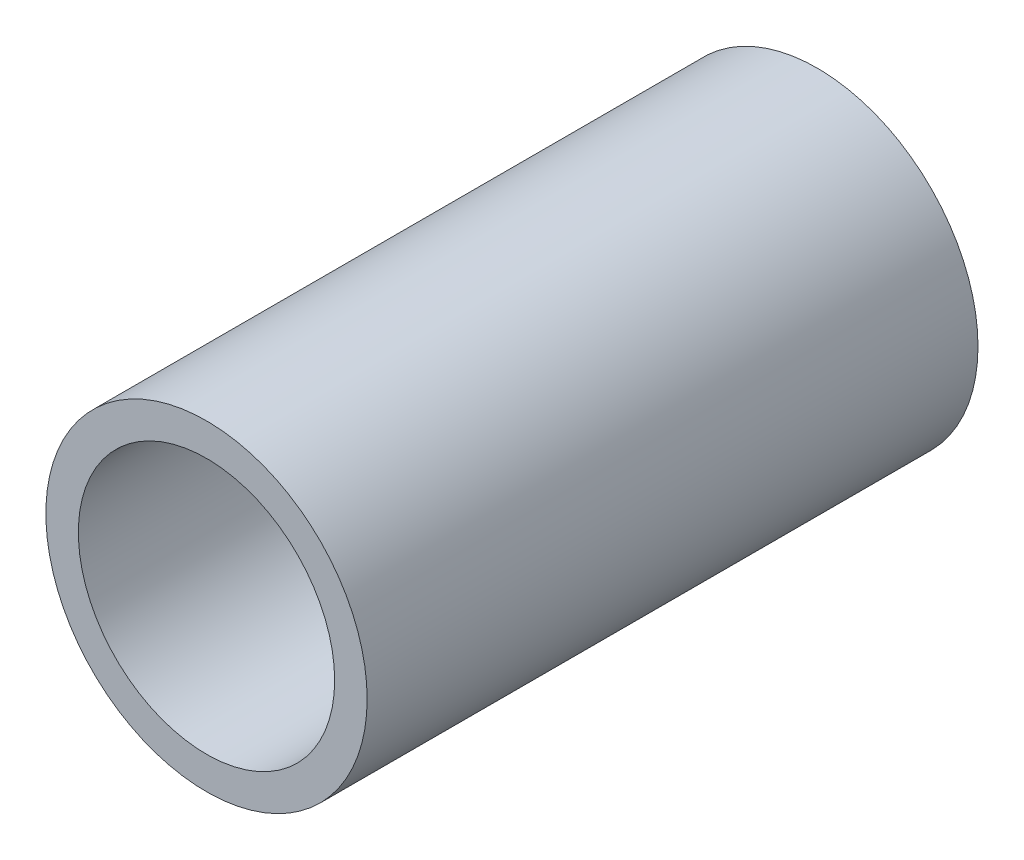
ISO-10303-21;
HEADER;
FILE_DESCRIPTION(('STEP AP214'),'2;1');
FILE_NAME('part.step','',(''),(''),'','','');
FILE_SCHEMA(('AUTOMOTIVE_DESIGN { 1 0 10303 214 1 1 1 1 }'));
ENDSEC;
DATA;
#1=APPLICATION_CONTEXT('core data for automotive mechanical design processes');
#2=APPLICATION_PROTOCOL_DEFINITION('international standard','automotive_design',2000,#1);
#3=PRODUCT_CONTEXT('',#1,'mechanical');
#4=PRODUCT('Part','Part','',(#3));
#5=PRODUCT_RELATED_PRODUCT_CATEGORY('part','',(#4));
#6=PRODUCT_DEFINITION_FORMATION('','',#4);
#7=PRODUCT_DEFINITION_CONTEXT('part definition',#1,'design');
#8=PRODUCT_DEFINITION('design','',#6,#7);
#9=PRODUCT_DEFINITION_SHAPE('','',#8);
#10=(LENGTH_UNIT() NAMED_UNIT(*) SI_UNIT(.MILLI.,.METRE.));
#11=(NAMED_UNIT(*) PLANE_ANGLE_UNIT() SI_UNIT($,.RADIAN.));
#12=(NAMED_UNIT(*) SI_UNIT($,.STERADIAN.) SOLID_ANGLE_UNIT());
#13=UNCERTAINTY_MEASURE_WITH_UNIT(LENGTH_MEASURE(1.E-05),#10,'distance_accuracy_value','');
#14=(GEOMETRIC_REPRESENTATION_CONTEXT(3) GLOBAL_UNCERTAINTY_ASSIGNED_CONTEXT((#13)) GLOBAL_UNIT_ASSIGNED_CONTEXT((#10,
#11,#12)) REPRESENTATION_CONTEXT('',''));
#15=CARTESIAN_POINT('',(0.,0.,0.));
#16=DIRECTION('',(0.,0.,1.));
#17=DIRECTION('',(1.,0.,0.));
#18=AXIS2_PLACEMENT_3D('',#15,#16,#17);
#19=CARTESIAN_POINT('',(0.,0.,31.75));
#20=DIRECTION('',(0.,0.,1.));
#21=DIRECTION('',(1.,0.,0.));
#22=AXIS2_PLACEMENT_3D('',#19,#20,#21);
#23=PLANE('',#22);
#24=CARTESIAN_POINT('',(0.,0.,31.75));
#25=DIRECTION('',(0.,0.,1.));
#26=DIRECTION('',(1.,0.,0.));
#27=AXIS2_PLACEMENT_3D('',#24,#25,#26);
#28=CIRCLE('',#27,16.7005);
#29=CARTESIAN_POINT('',(16.7005,0.,31.75));
#30=VERTEX_POINT('',#29);
#31=EDGE_CURVE('E11',#30,#30,#28,.T.);
#32=ORIENTED_EDGE('',*,*,#31,.T.);
#33=EDGE_LOOP('',(#32));
#34=FACE_BOUND('',#33,.T.);
#35=CARTESIAN_POINT('',(0.,0.,31.75));
#36=DIRECTION('',(0.,0.,1.));
#37=DIRECTION('',(1.,0.,0.));
#38=AXIS2_PLACEMENT_3D('',#35,#36,#37);
#39=CIRCLE('',#38,13.3223);
#40=CARTESIAN_POINT('',(13.3223,0.,31.75));
#41=VERTEX_POINT('',#40);
#42=EDGE_CURVE('E50',#41,#41,#39,.T.);
#43=ORIENTED_EDGE('',*,*,#42,.F.);
#44=EDGE_LOOP('',(#43));
#45=FACE_BOUND('',#44,.T.);
#46=ADVANCED_FACE('F39',(#34,#45),#23,.T.);
#47=CARTESIAN_POINT('',(0.,0.,-31.75));
#48=DIRECTION('',(0.,0.,1.));
#49=DIRECTION('',(1.,0.,0.));
#50=AXIS2_PLACEMENT_3D('',#47,#48,#49);
#51=PLANE('',#50);
#52=CARTESIAN_POINT('',(0.,0.,-31.75));
#53=DIRECTION('',(0.,0.,1.));
#54=DIRECTION('',(1.,0.,0.));
#55=AXIS2_PLACEMENT_3D('',#52,#53,#54);
#56=CIRCLE('',#55,16.7005);
#57=CARTESIAN_POINT('',(16.7005,0.,-31.75));
#58=VERTEX_POINT('',#57);
#59=EDGE_CURVE('E43',#58,#58,#56,.T.);
#60=ORIENTED_EDGE('',*,*,#59,.F.);
#61=EDGE_LOOP('',(#60));
#62=FACE_BOUND('',#61,.T.);
#63=CARTESIAN_POINT('',(0.,0.,-31.75));
#64=DIRECTION('',(0.,0.,1.));
#65=DIRECTION('',(1.,0.,0.));
#66=AXIS2_PLACEMENT_3D('',#63,#64,#65);
#67=CIRCLE('',#66,13.3223);
#68=CARTESIAN_POINT('',(13.3223,0.,-31.75));
#69=VERTEX_POINT('',#68);
#70=EDGE_CURVE('E52',#69,#69,#67,.T.);
#71=ORIENTED_EDGE('',*,*,#70,.T.);
#72=EDGE_LOOP('',(#71));
#73=FACE_BOUND('',#72,.T.);
#74=ADVANCED_FACE('F62',(#62,#73),#51,.F.);
#75=CARTESIAN_POINT('',(0.,0.,31.75));
#76=DIRECTION('',(0.,0.,-1.));
#77=DIRECTION('',(-1.,0.,0.));
#78=AXIS2_PLACEMENT_3D('',#75,#76,#77);
#79=CYLINDRICAL_SURFACE('',#78,16.7005);
#80=ORIENTED_EDGE('',*,*,#31,.F.);
#81=EDGE_LOOP('',(#80));
#82=FACE_BOUND('',#81,.T.);
#83=ORIENTED_EDGE('',*,*,#59,.T.);
#84=EDGE_LOOP('',(#83));
#85=FACE_BOUND('',#84,.T.);
#86=ADVANCED_FACE('F41',(#82,#85),#79,.T.);
#87=CARTESIAN_POINT('',(0.,0.,31.75));
#88=DIRECTION('',(0.,0.,-1.));
#89=DIRECTION('',(-1.,0.,0.));
#90=AXIS2_PLACEMENT_3D('',#87,#88,#89);
#91=CYLINDRICAL_SURFACE('',#90,13.3223);
#92=ORIENTED_EDGE('',*,*,#42,.T.);
#93=EDGE_LOOP('',(#92));
#94=FACE_BOUND('',#93,.T.);
#95=ORIENTED_EDGE('',*,*,#70,.F.);
#96=EDGE_LOOP('',(#95));
#97=FACE_BOUND('',#96,.T.);
#98=ADVANCED_FACE('F58',(#94,#97),#91,.F.);
#99=CLOSED_SHELL('',(#46,#74,#86,#98));
#100=MANIFOLD_SOLID_BREP('B2',#99);
#101=ADVANCED_BREP_SHAPE_REPRESENTATION('',(#18,#100),#14);
#102=SHAPE_DEFINITION_REPRESENTATION(#9,#101);
ENDSEC;
END-ISO-10303-21;
